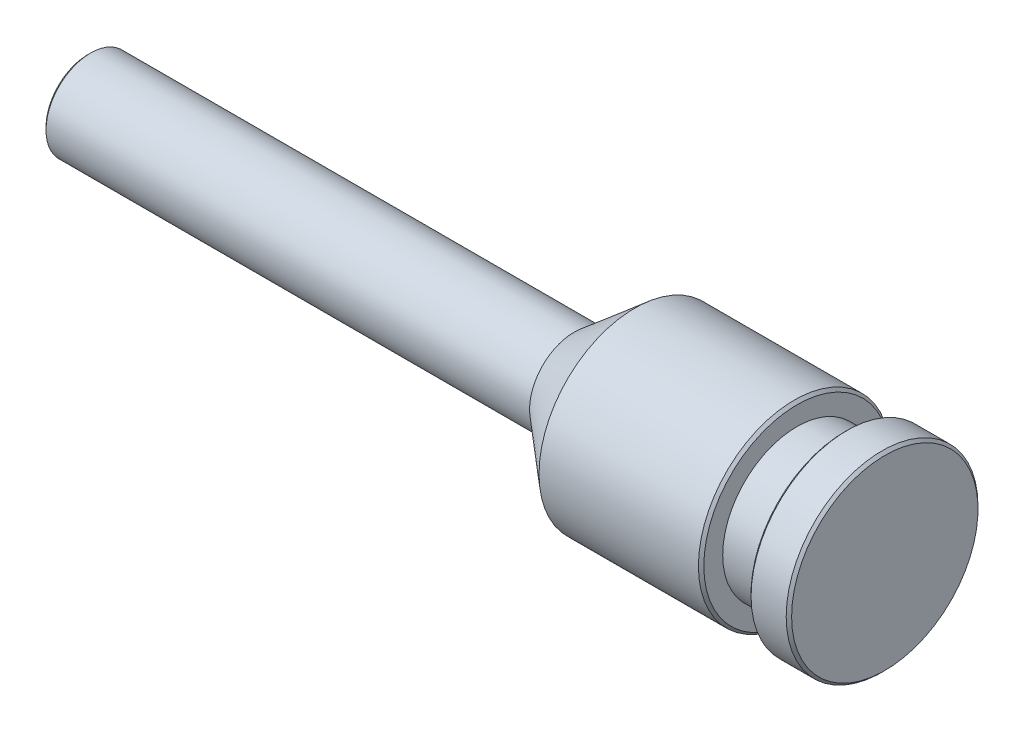
ISO-10303-21;
HEADER;
FILE_DESCRIPTION(('STEP AP214'),'2;1');
FILE_NAME('part.step','',(''),(''),'','','');
FILE_SCHEMA(('AUTOMOTIVE_DESIGN { 1 0 10303 214 1 1 1 1 }'));
ENDSEC;
DATA;
#1=APPLICATION_CONTEXT('core data for automotive mechanical design processes');
#2=APPLICATION_PROTOCOL_DEFINITION('international standard','automotive_design',2000,#1);
#3=PRODUCT_CONTEXT('',#1,'mechanical');
#4=PRODUCT('Part','Part','',(#3));
#5=PRODUCT_RELATED_PRODUCT_CATEGORY('part','',(#4));
#6=PRODUCT_DEFINITION_FORMATION('','',#4);
#7=PRODUCT_DEFINITION_CONTEXT('part definition',#1,'design');
#8=PRODUCT_DEFINITION('design','',#6,#7);
#9=PRODUCT_DEFINITION_SHAPE('','',#8);
#10=(LENGTH_UNIT() NAMED_UNIT(*) SI_UNIT(.MILLI.,.METRE.));
#11=(NAMED_UNIT(*) PLANE_ANGLE_UNIT() SI_UNIT($,.RADIAN.));
#12=(NAMED_UNIT(*) SI_UNIT($,.STERADIAN.) SOLID_ANGLE_UNIT());
#13=UNCERTAINTY_MEASURE_WITH_UNIT(LENGTH_MEASURE(1.E-05),#10,'distance_accuracy_value','');
#14=(GEOMETRIC_REPRESENTATION_CONTEXT(3) GLOBAL_UNCERTAINTY_ASSIGNED_CONTEXT((#13)) GLOBAL_UNIT_ASSIGNED_CONTEXT((#10,
#11,#12)) REPRESENTATION_CONTEXT('',''));
#15=CARTESIAN_POINT('',(0.,0.,0.));
#16=DIRECTION('',(0.,0.,1.));
#17=DIRECTION('',(1.,0.,0.));
#18=AXIS2_PLACEMENT_3D('',#15,#16,#17);
#19=CARTESIAN_POINT('',(59.,0.,0.));
#20=DIRECTION('',(-1.,0.,0.));
#21=DIRECTION('',(0.,0.,1.));
#22=AXIS2_PLACEMENT_3D('',#19,#20,#21);
#23=PLANE('',#22);
#24=CARTESIAN_POINT('',(59.,0.,0.));
#25=DIRECTION('',(-1.,0.,0.));
#26=DIRECTION('',(0.,0.,1.));
#27=AXIS2_PLACEMENT_3D('',#24,#25,#26);
#28=CIRCLE('',#27,6.9);
#29=CARTESIAN_POINT('',(59.,0.,6.9));
#30=VERTEX_POINT('',#29);
#31=EDGE_CURVE('E10',#30,#30,#28,.F.);
#32=ORIENTED_EDGE('',*,*,#31,.T.);
#33=EDGE_LOOP('',(#32));
#34=FACE_BOUND('',#33,.T.);
#35=ADVANCED_FACE('F36',(#34),#23,.F.);
#36=CARTESIAN_POINT('',(13.,0.,0.));
#37=DIRECTION('',(-1.,0.,0.));
#38=DIRECTION('',(0.,0.,1.));
#39=AXIS2_PLACEMENT_3D('',#36,#37,#38);
#40=CYLINDRICAL_SURFACE('',#39,7.1);
#41=CARTESIAN_POINT('',(56.2,0.,0.));
#42=DIRECTION('',(1.,0.,0.));
#43=DIRECTION('',(0.,0.,-1.));
#44=AXIS2_PLACEMENT_3D('',#41,#42,#43);
#45=CIRCLE('',#44,7.1);
#46=CARTESIAN_POINT('',(56.2,0.,-7.10000000000001));
#47=VERTEX_POINT('',#46);
#48=EDGE_CURVE('E43',#47,#47,#45,.T.);
#49=ORIENTED_EDGE('',*,*,#48,.T.);
#50=EDGE_LOOP('',(#49));
#51=FACE_BOUND('',#50,.T.);
#52=CARTESIAN_POINT('',(58.8,0.,0.));
#53=DIRECTION('',(-1.,0.,0.));
#54=DIRECTION('',(0.,0.,1.));
#55=AXIS2_PLACEMENT_3D('',#52,#53,#54);
#56=CIRCLE('',#55,7.1);
#57=CARTESIAN_POINT('',(58.8,0.,7.10000000000008));
#58=VERTEX_POINT('',#57);
#59=EDGE_CURVE('E47',#58,#58,#56,.T.);
#60=ORIENTED_EDGE('',*,*,#59,.T.);
#61=EDGE_LOOP('',(#60));
#62=FACE_BOUND('',#61,.T.);
#63=ADVANCED_FACE('F107',(#51,#62),#40,.T.);
#64=CARTESIAN_POINT('',(56.,7.10000000000003,0.));
#65=DIRECTION('',(1.,0.,0.));
#66=DIRECTION('',(0.,0.,-1.));
#67=AXIS2_PLACEMENT_3D('',#64,#65,#66);
#68=PLANE('',#67);
#69=CARTESIAN_POINT('',(56.,0.,0.));
#70=DIRECTION('',(1.,0.,0.));
#71=DIRECTION('',(0.,0.,-1.));
#72=AXIS2_PLACEMENT_3D('',#69,#70,#71);
#73=CIRCLE('',#72,6.9);
#74=CARTESIAN_POINT('',(56.,0.,-6.90000000000002));
#75=VERTEX_POINT('',#74);
#76=EDGE_CURVE('E51',#75,#75,#73,.F.);
#77=ORIENTED_EDGE('',*,*,#76,.T.);
#78=EDGE_LOOP('',(#77));
#79=FACE_BOUND('',#78,.T.);
#80=CARTESIAN_POINT('',(56.,0.,0.));
#81=DIRECTION('',(-1.,0.,0.));
#82=DIRECTION('',(0.,0.,1.));
#83=AXIS2_PLACEMENT_3D('',#80,#81,#82);
#84=CIRCLE('',#83,5.5);
#85=CARTESIAN_POINT('',(56.,0.,5.50000000000001));
#86=VERTEX_POINT('',#85);
#87=EDGE_CURVE('E68',#86,#86,#84,.T.);
#88=ORIENTED_EDGE('',*,*,#87,.F.);
#89=EDGE_LOOP('',(#88));
#90=FACE_BOUND('',#89,.T.);
#91=ADVANCED_FACE('F112',(#79,#90),#68,.F.);
#92=CARTESIAN_POINT('',(13.,0.,0.));
#93=DIRECTION('',(-1.,0.,0.));
#94=DIRECTION('',(0.,0.,1.));
#95=AXIS2_PLACEMENT_3D('',#92,#93,#94);
#96=CYLINDRICAL_SURFACE('',#95,5.5);
#97=CARTESIAN_POINT('',(52.5,0.,0.));
#98=DIRECTION('',(-1.,0.,0.));
#99=DIRECTION('',(0.,0.,1.));
#100=AXIS2_PLACEMENT_3D('',#97,#98,#99);
#101=CIRCLE('',#100,5.5);
#102=CARTESIAN_POINT('',(52.5,0.,5.50000000000001));
#103=VERTEX_POINT('',#102);
#104=EDGE_CURVE('E71',#103,#103,#101,.T.);
#105=ORIENTED_EDGE('',*,*,#104,.F.);
#106=EDGE_LOOP('',(#105));
#107=FACE_BOUND('',#106,.T.);
#108=ORIENTED_EDGE('',*,*,#87,.T.);
#109=EDGE_LOOP('',(#108));
#110=FACE_BOUND('',#109,.T.);
#111=ADVANCED_FACE('F135',(#107,#110),#96,.T.);
#112=CARTESIAN_POINT('',(52.5,5.49999999999996,0.));
#113=DIRECTION('',(-1.,0.,0.));
#114=DIRECTION('',(0.,0.,1.));
#115=AXIS2_PLACEMENT_3D('',#112,#113,#114);
#116=PLANE('',#115);
#117=CARTESIAN_POINT('',(52.5,0.,0.));
#118=DIRECTION('',(-1.,0.,0.));
#119=DIRECTION('',(0.,0.,1.));
#120=AXIS2_PLACEMENT_3D('',#117,#118,#119);
#121=CIRCLE('',#120,6.9);
#122=CARTESIAN_POINT('',(52.5,0.,6.90000000000002));
#123=VERTEX_POINT('',#122);
#124=EDGE_CURVE('E56',#123,#123,#121,.F.);
#125=ORIENTED_EDGE('',*,*,#124,.T.);
#126=EDGE_LOOP('',(#125));
#127=FACE_BOUND('',#126,.T.);
#128=ORIENTED_EDGE('',*,*,#104,.T.);
#129=EDGE_LOOP('',(#128));
#130=FACE_BOUND('',#129,.T.);
#131=ADVANCED_FACE('F139',(#127,#130),#116,.F.);
#132=CARTESIAN_POINT('',(13.,0.,0.));
#133=DIRECTION('',(-1.,0.,0.));
#134=DIRECTION('',(0.,0.,1.));
#135=AXIS2_PLACEMENT_3D('',#132,#133,#134);
#136=CYLINDRICAL_SURFACE('',#135,7.09999999999998);
#137=CARTESIAN_POINT('',(52.3,0.,0.));
#138=DIRECTION('',(-1.,0.,0.));
#139=DIRECTION('',(0.,0.,1.));
#140=AXIS2_PLACEMENT_3D('',#137,#138,#139);
#141=CIRCLE('',#140,7.09999999999998);
#142=CARTESIAN_POINT('',(52.3,0.,7.09999999999993));
#143=VERTEX_POINT('',#142);
#144=EDGE_CURVE('E59',#143,#143,#141,.T.);
#145=ORIENTED_EDGE('',*,*,#144,.T.);
#146=EDGE_LOOP('',(#145));
#147=FACE_BOUND('',#146,.T.);
#148=CARTESIAN_POINT('',(40.5,0.,0.));
#149=DIRECTION('',(-1.,0.,0.));
#150=DIRECTION('',(0.,0.,1.));
#151=AXIS2_PLACEMENT_3D('',#148,#149,#150);
#152=CIRCLE('',#151,7.09999999999998);
#153=CARTESIAN_POINT('',(40.5,0.,7.10000000000007));
#154=VERTEX_POINT('',#153);
#155=EDGE_CURVE('E74',#154,#154,#152,.T.);
#156=ORIENTED_EDGE('',*,*,#155,.F.);
#157=EDGE_LOOP('',(#156));
#158=FACE_BOUND('',#157,.T.);
#159=ADVANCED_FACE('F145',(#147,#158),#136,.T.);
#160=CARTESIAN_POINT('',(40.5,0.,0.));
#161=DIRECTION('',(1.,0.,0.));
#162=DIRECTION('',(0.,0.,-1.));
#163=AXIS2_PLACEMENT_3D('',#160,#161,#162);
#164=CONICAL_SURFACE('',#163,7.09999999999998,0.701259922866276);
#165=CARTESIAN_POINT('',(36.,0.,0.));
#166=DIRECTION('',(-1.,0.,0.));
#167=DIRECTION('',(0.,0.,1.));
#168=AXIS2_PLACEMENT_3D('',#165,#166,#167);
#169=CIRCLE('',#168,3.3);
#170=CARTESIAN_POINT('',(36.,0.,3.3));
#171=VERTEX_POINT('',#170);
#172=EDGE_CURVE('E77',#171,#171,#169,.T.);
#173=ORIENTED_EDGE('',*,*,#172,.F.);
#174=EDGE_LOOP('',(#173));
#175=FACE_BOUND('',#174,.T.);
#176=ORIENTED_EDGE('',*,*,#155,.T.);
#177=EDGE_LOOP('',(#176));
#178=FACE_BOUND('',#177,.T.);
#179=ADVANCED_FACE('F103',(#175,#178),#164,.T.);
#180=CARTESIAN_POINT('',(13.,0.,0.));
#181=DIRECTION('',(-1.,0.,0.));
#182=DIRECTION('',(0.,0.,1.));
#183=AXIS2_PLACEMENT_3D('',#180,#181,#182);
#184=CYLINDRICAL_SURFACE('',#183,3.29999999999999);
#185=CARTESIAN_POINT('',(0.200000000000016,0.,0.));
#186=DIRECTION('',(1.,0.,0.));
#187=DIRECTION('',(0.,0.,-1.));
#188=AXIS2_PLACEMENT_3D('',#185,#186,#187);
#189=CIRCLE('',#188,3.29999999999999);
#190=CARTESIAN_POINT('',(0.200000000000016,0.,-3.3));
#191=VERTEX_POINT('',#190);
#192=EDGE_CURVE('E62',#191,#191,#189,.T.);
#193=ORIENTED_EDGE('',*,*,#192,.T.);
#194=EDGE_LOOP('',(#193));
#195=FACE_BOUND('',#194,.T.);
#196=ORIENTED_EDGE('',*,*,#172,.T.);
#197=EDGE_LOOP('',(#196));
#198=FACE_BOUND('',#197,.T.);
#199=ADVANCED_FACE('F97',(#195,#198),#184,.T.);
#200=CARTESIAN_POINT('',(0.,1.85,0.));
#201=DIRECTION('',(1.,0.,0.));
#202=DIRECTION('',(0.,0.,-1.));
#203=AXIS2_PLACEMENT_3D('',#200,#201,#202);
#204=PLANE('',#203);
#205=CARTESIAN_POINT('',(0.,0.,0.));
#206=DIRECTION('',(1.,0.,0.));
#207=DIRECTION('',(0.,0.,-1.));
#208=AXIS2_PLACEMENT_3D('',#205,#206,#207);
#209=CIRCLE('',#208,3.09999999999999);
#210=CARTESIAN_POINT('',(0.,0.,-3.1));
#211=VERTEX_POINT('',#210);
#212=EDGE_CURVE('E65',#211,#211,#209,.F.);
#213=ORIENTED_EDGE('',*,*,#212,.T.);
#214=EDGE_LOOP('',(#213));
#215=FACE_BOUND('',#214,.T.);
#216=CARTESIAN_POINT('',(0.,0.,0.));
#217=DIRECTION('',(-1.,0.,0.));
#218=DIRECTION('',(0.,0.,1.));
#219=AXIS2_PLACEMENT_3D('',#216,#217,#218);
#220=CIRCLE('',#219,1.85);
#221=CARTESIAN_POINT('',(0.,0.,1.85));
#222=VERTEX_POINT('',#221);
#223=EDGE_CURVE('E80',#222,#222,#220,.T.);
#224=ORIENTED_EDGE('',*,*,#223,.F.);
#225=EDGE_LOOP('',(#224));
#226=FACE_BOUND('',#225,.T.);
#227=ADVANCED_FACE('F92',(#215,#226),#204,.F.);
#228=CARTESIAN_POINT('',(13.,0.,0.));
#229=DIRECTION('',(-1.,0.,0.));
#230=DIRECTION('',(0.,0.,1.));
#231=AXIS2_PLACEMENT_3D('',#228,#229,#230);
#232=CYLINDRICAL_SURFACE('',#231,1.85);
#233=CARTESIAN_POINT('',(13.,0.,0.));
#234=DIRECTION('',(-1.,0.,0.));
#235=DIRECTION('',(0.,0.,1.));
#236=AXIS2_PLACEMENT_3D('',#233,#234,#235);
#237=CIRCLE('',#236,1.85);
#238=CARTESIAN_POINT('',(13.,0.,1.85));
#239=VERTEX_POINT('',#238);
#240=EDGE_CURVE('E83',#239,#239,#237,.T.);
#241=ORIENTED_EDGE('',*,*,#240,.F.);
#242=EDGE_LOOP('',(#241));
#243=FACE_BOUND('',#242,.T.);
#244=ORIENTED_EDGE('',*,*,#223,.T.);
#245=EDGE_LOOP('',(#244));
#246=FACE_BOUND('',#245,.T.);
#247=ADVANCED_FACE('F89',(#243,#246),#232,.F.);
#248=CARTESIAN_POINT('',(13.,1.85,0.));
#249=DIRECTION('',(1.,0.,0.));
#250=DIRECTION('',(0.,0.,-1.));
#251=AXIS2_PLACEMENT_3D('',#248,#249,#250);
#252=PLANE('',#251);
#253=ORIENTED_EDGE('',*,*,#240,.T.);
#254=EDGE_LOOP('',(#253));
#255=FACE_BOUND('',#254,.T.);
#256=ADVANCED_FACE('F87',(#255),#252,.F.);
#257=CARTESIAN_POINT('',(0.,0.,0.));
#258=DIRECTION('',(1.,0.,0.));
#259=DIRECTION('',(0.,0.,-1.));
#260=AXIS2_PLACEMENT_3D('',#257,#258,#259);
#261=CONICAL_SURFACE('',#260,3.09999999999999,0.785398163397438);
#262=ORIENTED_EDGE('',*,*,#192,.F.);
#263=EDGE_LOOP('',(#262));
#264=FACE_BOUND('',#263,.T.);
#265=ORIENTED_EDGE('',*,*,#212,.F.);
#266=EDGE_LOOP('',(#265));
#267=FACE_BOUND('',#266,.T.);
#268=ADVANCED_FACE('F116',(#264,#267),#261,.T.);
#269=CARTESIAN_POINT('',(52.3,0.,0.));
#270=DIRECTION('',(-1.,0.,0.));
#271=DIRECTION('',(0.,0.,1.));
#272=AXIS2_PLACEMENT_3D('',#269,#270,#271);
#273=CONICAL_SURFACE('',#272,7.09999999999998,0.78539816339744);
#274=ORIENTED_EDGE('',*,*,#124,.F.);
#275=EDGE_LOOP('',(#274));
#276=FACE_BOUND('',#275,.T.);
#277=ORIENTED_EDGE('',*,*,#144,.F.);
#278=EDGE_LOOP('',(#277));
#279=FACE_BOUND('',#278,.T.);
#280=ADVANCED_FACE('F119',(#276,#279),#273,.T.);
#281=CARTESIAN_POINT('',(56.,0.,0.));
#282=DIRECTION('',(1.,0.,0.));
#283=DIRECTION('',(0.,0.,-1.));
#284=AXIS2_PLACEMENT_3D('',#281,#282,#283);
#285=CONICAL_SURFACE('',#284,6.9,0.785398163397442);
#286=ORIENTED_EDGE('',*,*,#48,.F.);
#287=EDGE_LOOP('',(#286));
#288=FACE_BOUND('',#287,.T.);
#289=ORIENTED_EDGE('',*,*,#76,.F.);
#290=EDGE_LOOP('',(#289));
#291=FACE_BOUND('',#290,.T.);
#292=ADVANCED_FACE('F122',(#288,#291),#285,.T.);
#293=CARTESIAN_POINT('',(58.8,0.,0.));
#294=DIRECTION('',(-1.,0.,0.));
#295=DIRECTION('',(0.,0.,1.));
#296=AXIS2_PLACEMENT_3D('',#293,#294,#295);
#297=CONICAL_SURFACE('',#296,7.1,0.785398163397425);
#298=ORIENTED_EDGE('',*,*,#31,.F.);
#299=EDGE_LOOP('',(#298));
#300=FACE_BOUND('',#299,.T.);
#301=ORIENTED_EDGE('',*,*,#59,.F.);
#302=EDGE_LOOP('',(#301));
#303=FACE_BOUND('',#302,.T.);
#304=ADVANCED_FACE('F38',(#300,#303),#297,.T.);
#305=CLOSED_SHELL('',(#35,#63,#91,#111,#131,#159,#179,#199,#227,#247,#256,#268,#280,#292,#304));
#306=MANIFOLD_SOLID_BREP('B2',#305);
#307=ADVANCED_BREP_SHAPE_REPRESENTATION('',(#18,#306),#14);
#308=SHAPE_DEFINITION_REPRESENTATION(#9,#307);
ENDSEC;
END-ISO-10303-21;
